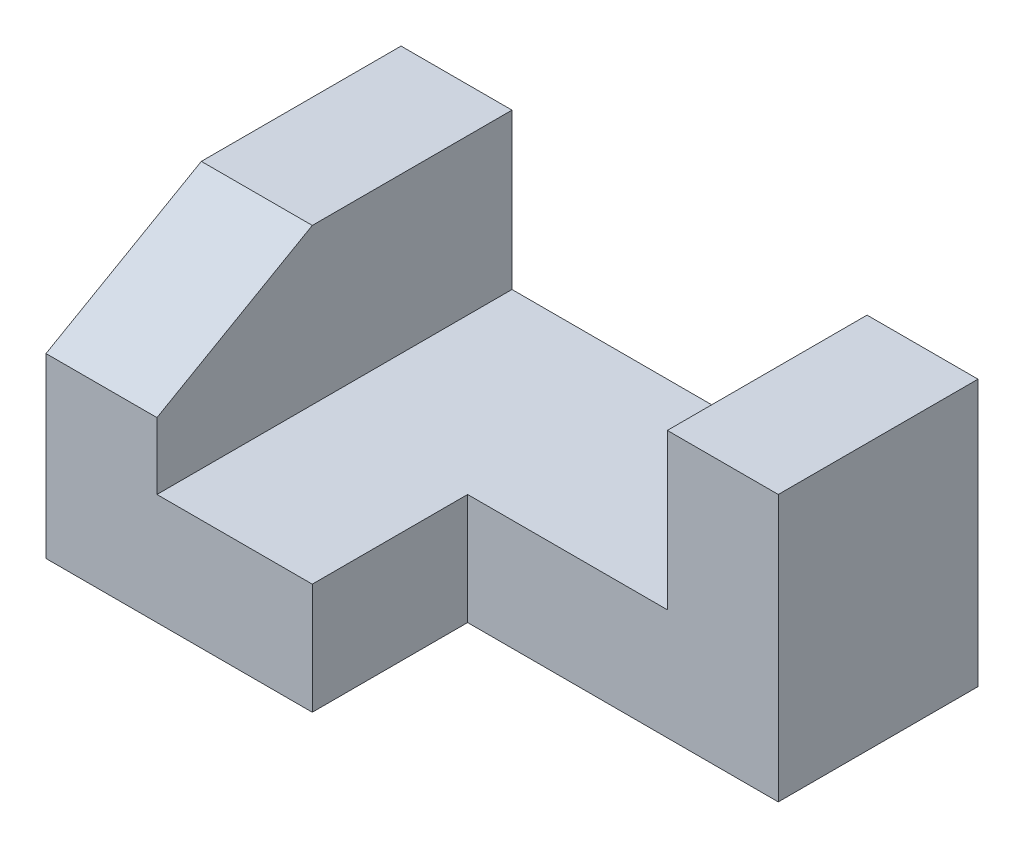
ISO-10303-21;
HEADER;
FILE_DESCRIPTION(('STEP AP214'),'2;1');
FILE_NAME('part.step','',(''),(''),'','','');
FILE_SCHEMA(('AUTOMOTIVE_DESIGN { 1 0 10303 214 1 1 1 1 }'));
ENDSEC;
DATA;
#1=APPLICATION_CONTEXT('core data for automotive mechanical design processes');
#2=APPLICATION_PROTOCOL_DEFINITION('international standard','automotive_design',2000,#1);
#3=PRODUCT_CONTEXT('',#1,'mechanical');
#4=PRODUCT('Part','Part','',(#3));
#5=PRODUCT_RELATED_PRODUCT_CATEGORY('part','',(#4));
#6=PRODUCT_DEFINITION_FORMATION('','',#4);
#7=PRODUCT_DEFINITION_CONTEXT('part definition',#1,'design');
#8=PRODUCT_DEFINITION('design','',#6,#7);
#9=PRODUCT_DEFINITION_SHAPE('','',#8);
#10=(LENGTH_UNIT() NAMED_UNIT(*) SI_UNIT(.MILLI.,.METRE.));
#11=(NAMED_UNIT(*) PLANE_ANGLE_UNIT() SI_UNIT($,.RADIAN.));
#12=(NAMED_UNIT(*) SI_UNIT($,.STERADIAN.) SOLID_ANGLE_UNIT());
#13=UNCERTAINTY_MEASURE_WITH_UNIT(LENGTH_MEASURE(1.E-05),#10,'distance_accuracy_value','');
#14=(GEOMETRIC_REPRESENTATION_CONTEXT(3) GLOBAL_UNCERTAINTY_ASSIGNED_CONTEXT((#13)) GLOBAL_UNIT_ASSIGNED_CONTEXT((#10,
#11,#12)) REPRESENTATION_CONTEXT('',''));
#15=CARTESIAN_POINT('',(0.,0.,0.));
#16=DIRECTION('',(0.,0.,1.));
#17=DIRECTION('',(1.,0.,0.));
#18=AXIS2_PLACEMENT_3D('',#15,#16,#17);
#19=CARTESIAN_POINT('',(0.,25.,0.));
#20=DIRECTION('',(0.,-1.,0.));
#21=DIRECTION('',(0.,0.,-1.));
#22=AXIS2_PLACEMENT_3D('',#19,#20,#21);
#23=PLANE('',#22);
#24=DIRECTION('',(-1.,0.,0.));
#25=VECTOR('',#24,1.);
#26=CARTESIAN_POINT('',(130.,25.,-35.));
#27=LINE('',#26,#25);
#28=CARTESIAN_POINT('',(105.,25.,-35.));
#29=VERTEX_POINT('',#28);
#30=CARTESIAN_POINT('',(60.,25.,-35.));
#31=VERTEX_POINT('',#30);
#32=EDGE_CURVE('E152',#29,#31,#27,.T.);
#33=ORIENTED_EDGE('',*,*,#32,.F.);
#34=DIRECTION('',(0.,0.,-1.));
#35=VECTOR('',#34,1.);
#36=CARTESIAN_POINT('',(105.,25.,-35.));
#37=LINE('',#36,#35);
#38=CARTESIAN_POINT('',(105.,25.,-80.));
#39=VERTEX_POINT('',#38);
#40=EDGE_CURVE('E211',#29,#39,#37,.T.);
#41=ORIENTED_EDGE('',*,*,#40,.T.);
#42=DIRECTION('',(1.,0.,0.));
#43=VECTOR('',#42,1.);
#44=CARTESIAN_POINT('',(0.,25.,-80.));
#45=LINE('',#44,#43);
#46=CARTESIAN_POINT('',(25.,25.,-80.));
#47=VERTEX_POINT('',#46);
#48=EDGE_CURVE('E109',#47,#39,#45,.T.);
#49=ORIENTED_EDGE('',*,*,#48,.F.);
#50=DIRECTION('',(0.,0.,-1.));
#51=VECTOR('',#50,1.);
#52=CARTESIAN_POINT('',(25.,25.,0.));
#53=LINE('',#52,#51);
#54=CARTESIAN_POINT('',(25.,25.,0.));
#55=VERTEX_POINT('',#54);
#56=EDGE_CURVE('E57',#55,#47,#53,.T.);
#57=ORIENTED_EDGE('',*,*,#56,.F.);
#58=DIRECTION('',(1.,0.,0.));
#59=VECTOR('',#58,1.);
#60=CARTESIAN_POINT('',(0.,25.,0.));
#61=LINE('',#60,#59);
#62=CARTESIAN_POINT('',(60.,25.,0.));
#63=VERTEX_POINT('',#62);
#64=EDGE_CURVE('E62',#55,#63,#61,.T.);
#65=ORIENTED_EDGE('',*,*,#64,.T.);
#66=DIRECTION('',(0.,0.,-1.));
#67=VECTOR('',#66,1.);
#68=CARTESIAN_POINT('',(60.,25.,0.));
#69=LINE('',#68,#67);
#70=EDGE_CURVE('E150',#63,#31,#69,.T.);
#71=ORIENTED_EDGE('',*,*,#70,.T.);
#72=EDGE_LOOP('',(#33,#41,#49,#57,#65,#71));
#73=FACE_BOUND('',#72,.T.);
#74=ADVANCED_FACE('F39',(#73),#23,.F.);
#75=CARTESIAN_POINT('',(0.,25.,0.));
#76=DIRECTION('',(-1.,0.,0.));
#77=DIRECTION('',(0.,0.,1.));
#78=AXIS2_PLACEMENT_3D('',#75,#76,#77);
#79=PLANE('',#78);
#80=DIRECTION('',(0.,0.,-1.));
#81=VECTOR('',#80,1.);
#82=CARTESIAN_POINT('',(0.,0.,0.));
#83=LINE('',#82,#81);
#84=CARTESIAN_POINT('',(0.,0.,0.));
#85=VERTEX_POINT('',#84);
#86=CARTESIAN_POINT('',(0.,0.,-80.));
#87=VERTEX_POINT('',#86);
#88=EDGE_CURVE('E104',#85,#87,#83,.T.);
#89=ORIENTED_EDGE('',*,*,#88,.F.);
#90=DIRECTION('',(0.,-1.,0.));
#91=VECTOR('',#90,1.);
#92=CARTESIAN_POINT('',(0.,25.,0.));
#93=LINE('',#92,#91);
#94=CARTESIAN_POINT('',(0.,40.,0.));
#95=VERTEX_POINT('',#94);
#96=EDGE_CURVE('E11',#95,#85,#93,.T.);
#97=ORIENTED_EDGE('',*,*,#96,.F.);
#98=DIRECTION('',(0.,0.496138938356834,-0.868243142124459));
#99=VECTOR('',#98,1.);
#100=CARTESIAN_POINT('',(0.,30.1538461538462,17.2307692307692));
#101=LINE('',#100,#99);
#102=CARTESIAN_POINT('',(0.,60.,-35.));
#103=VERTEX_POINT('',#102);
#104=EDGE_CURVE('E172',#95,#103,#101,.T.);
#105=ORIENTED_EDGE('',*,*,#104,.T.);
#106=DIRECTION('',(0.,0.,1.));
#107=VECTOR('',#106,1.);
#108=CARTESIAN_POINT('',(0.,60.,0.));
#109=LINE('',#108,#107);
#110=CARTESIAN_POINT('',(0.,60.,-80.));
#111=VERTEX_POINT('',#110);
#112=EDGE_CURVE('E167',#111,#103,#109,.T.);
#113=ORIENTED_EDGE('',*,*,#112,.F.);
#114=DIRECTION('',(0.,-1.,0.));
#115=VECTOR('',#114,1.);
#116=CARTESIAN_POINT('',(0.,25.,-80.));
#117=LINE('',#116,#115);
#118=EDGE_CURVE('E43',#111,#87,#117,.T.);
#119=ORIENTED_EDGE('',*,*,#118,.T.);
#120=EDGE_LOOP('',(#89,#97,#105,#113,#119));
#121=FACE_BOUND('',#120,.T.);
#122=ADVANCED_FACE('F41',(#121),#79,.T.);
#123=CARTESIAN_POINT('',(0.,25.,0.));
#124=DIRECTION('',(0.,0.,-1.));
#125=DIRECTION('',(-1.,0.,0.));
#126=AXIS2_PLACEMENT_3D('',#123,#124,#125);
#127=PLANE('',#126);
#128=DIRECTION('',(1.,0.,0.));
#129=VECTOR('',#128,1.);
#130=CARTESIAN_POINT('',(0.,0.,0.));
#131=LINE('',#130,#129);
#132=CARTESIAN_POINT('',(60.,0.,0.));
#133=VERTEX_POINT('',#132);
#134=EDGE_CURVE('E89',#85,#133,#131,.T.);
#135=ORIENTED_EDGE('',*,*,#134,.T.);
#136=DIRECTION('',(0.,-1.,0.));
#137=VECTOR('',#136,1.);
#138=CARTESIAN_POINT('',(60.,25.,0.));
#139=LINE('',#138,#137);
#140=EDGE_CURVE('E49',#63,#133,#139,.T.);
#141=ORIENTED_EDGE('',*,*,#140,.F.);
#142=ORIENTED_EDGE('',*,*,#64,.F.);
#143=DIRECTION('',(0.,1.,0.));
#144=VECTOR('',#143,1.);
#145=CARTESIAN_POINT('',(25.,0.,0.));
#146=LINE('',#145,#144);
#147=CARTESIAN_POINT('',(25.,40.,0.));
#148=VERTEX_POINT('',#147);
#149=EDGE_CURVE('E171',#55,#148,#146,.T.);
#150=ORIENTED_EDGE('',*,*,#149,.T.);
#151=DIRECTION('',(-1.,0.,0.));
#152=VECTOR('',#151,1.);
#153=CARTESIAN_POINT('',(25.,40.,0.));
#154=LINE('',#153,#152);
#155=EDGE_CURVE('E94',#148,#95,#154,.T.);
#156=ORIENTED_EDGE('',*,*,#155,.T.);
#157=ORIENTED_EDGE('',*,*,#96,.T.);
#158=EDGE_LOOP('',(#135,#141,#142,#150,#156,#157));
#159=FACE_BOUND('',#158,.T.);
#160=ADVANCED_FACE('F88',(#159),#127,.F.);
#161=CARTESIAN_POINT('',(60.,25.,0.));
#162=DIRECTION('',(-1.,0.,0.));
#163=DIRECTION('',(0.,0.,1.));
#164=AXIS2_PLACEMENT_3D('',#161,#162,#163);
#165=PLANE('',#164);
#166=DIRECTION('',(0.,0.,-1.));
#167=VECTOR('',#166,1.);
#168=CARTESIAN_POINT('',(60.,0.,0.));
#169=LINE('',#168,#167);
#170=CARTESIAN_POINT('',(60.,0.,-35.));
#171=VERTEX_POINT('',#170);
#172=EDGE_CURVE('E107',#133,#171,#169,.T.);
#173=ORIENTED_EDGE('',*,*,#172,.T.);
#174=DIRECTION('',(0.,-1.,0.));
#175=VECTOR('',#174,1.);
#176=CARTESIAN_POINT('',(60.,25.,-35.));
#177=LINE('',#176,#175);
#178=EDGE_CURVE('E138',#31,#171,#177,.T.);
#179=ORIENTED_EDGE('',*,*,#178,.F.);
#180=ORIENTED_EDGE('',*,*,#70,.F.);
#181=ORIENTED_EDGE('',*,*,#140,.T.);
#182=EDGE_LOOP('',(#173,#179,#180,#181));
#183=FACE_BOUND('',#182,.T.);
#184=ADVANCED_FACE('F268',(#183),#165,.F.);
#185=CARTESIAN_POINT('',(130.,25.,-35.));
#186=DIRECTION('',(0.,0.,1.));
#187=DIRECTION('',(1.,0.,0.));
#188=AXIS2_PLACEMENT_3D('',#185,#186,#187);
#189=PLANE('',#188);
#190=DIRECTION('',(-1.,0.,0.));
#191=VECTOR('',#190,1.);
#192=CARTESIAN_POINT('',(130.,0.,-35.));
#193=LINE('',#192,#191);
#194=CARTESIAN_POINT('',(130.,0.,-35.));
#195=VERTEX_POINT('',#194);
#196=EDGE_CURVE('E131',#195,#171,#193,.T.);
#197=ORIENTED_EDGE('',*,*,#196,.F.);
#198=DIRECTION('',(0.,-1.,0.));
#199=VECTOR('',#198,1.);
#200=CARTESIAN_POINT('',(130.,25.,-35.));
#201=LINE('',#200,#199);
#202=CARTESIAN_POINT('',(130.,60.,-35.));
#203=VERTEX_POINT('',#202);
#204=EDGE_CURVE('E141',#203,#195,#201,.T.);
#205=ORIENTED_EDGE('',*,*,#204,.F.);
#206=DIRECTION('',(1.,0.,0.));
#207=VECTOR('',#206,1.);
#208=CARTESIAN_POINT('',(105.,60.,-35.));
#209=LINE('',#208,#207);
#210=CARTESIAN_POINT('',(105.,60.,-35.));
#211=VERTEX_POINT('',#210);
#212=EDGE_CURVE('E175',#211,#203,#209,.T.);
#213=ORIENTED_EDGE('',*,*,#212,.F.);
#214=DIRECTION('',(0.,-1.,0.));
#215=VECTOR('',#214,1.);
#216=CARTESIAN_POINT('',(105.,25.,-35.));
#217=LINE('',#216,#215);
#218=EDGE_CURVE('E203',#211,#29,#217,.T.);
#219=ORIENTED_EDGE('',*,*,#218,.T.);
#220=ORIENTED_EDGE('',*,*,#32,.T.);
#221=ORIENTED_EDGE('',*,*,#178,.T.);
#222=EDGE_LOOP('',(#197,#205,#213,#219,#220,#221));
#223=FACE_BOUND('',#222,.T.);
#224=ADVANCED_FACE('F222',(#223),#189,.T.);
#225=CARTESIAN_POINT('',(130.,25.,-35.));
#226=DIRECTION('',(-1.,0.,0.));
#227=DIRECTION('',(0.,0.,1.));
#228=AXIS2_PLACEMENT_3D('',#225,#226,#227);
#229=PLANE('',#228);
#230=DIRECTION('',(0.,0.,-1.));
#231=VECTOR('',#230,1.);
#232=CARTESIAN_POINT('',(130.,0.,-35.));
#233=LINE('',#232,#231);
#234=CARTESIAN_POINT('',(130.,0.,-80.));
#235=VERTEX_POINT('',#234);
#236=EDGE_CURVE('E120',#195,#235,#233,.T.);
#237=ORIENTED_EDGE('',*,*,#236,.T.);
#238=DIRECTION('',(0.,-1.,0.));
#239=VECTOR('',#238,1.);
#240=CARTESIAN_POINT('',(130.,25.,-80.));
#241=LINE('',#240,#239);
#242=CARTESIAN_POINT('',(130.,60.,-80.));
#243=VERTEX_POINT('',#242);
#244=EDGE_CURVE('E143',#243,#235,#241,.T.);
#245=ORIENTED_EDGE('',*,*,#244,.F.);
#246=DIRECTION('',(0.,0.,1.));
#247=VECTOR('',#246,1.);
#248=CARTESIAN_POINT('',(130.,60.,-35.));
#249=LINE('',#248,#247);
#250=EDGE_CURVE('E199',#243,#203,#249,.T.);
#251=ORIENTED_EDGE('',*,*,#250,.T.);
#252=ORIENTED_EDGE('',*,*,#204,.T.);
#253=EDGE_LOOP('',(#237,#245,#251,#252));
#254=FACE_BOUND('',#253,.T.);
#255=ADVANCED_FACE('F265',(#254),#229,.F.);
#256=CARTESIAN_POINT('',(0.,25.,-80.));
#257=DIRECTION('',(0.,0.,-1.));
#258=DIRECTION('',(-1.,0.,0.));
#259=AXIS2_PLACEMENT_3D('',#256,#257,#258);
#260=PLANE('',#259);
#261=DIRECTION('',(1.,0.,0.));
#262=VECTOR('',#261,1.);
#263=CARTESIAN_POINT('',(0.,0.,-80.));
#264=LINE('',#263,#262);
#265=EDGE_CURVE('E115',#87,#235,#264,.T.);
#266=ORIENTED_EDGE('',*,*,#265,.F.);
#267=ORIENTED_EDGE('',*,*,#118,.F.);
#268=DIRECTION('',(-1.,0.,0.));
#269=VECTOR('',#268,1.);
#270=CARTESIAN_POINT('',(25.,60.,-80.));
#271=LINE('',#270,#269);
#272=CARTESIAN_POINT('',(25.,60.,-80.));
#273=VERTEX_POINT('',#272);
#274=EDGE_CURVE('E116',#273,#111,#271,.T.);
#275=ORIENTED_EDGE('',*,*,#274,.F.);
#276=DIRECTION('',(0.,1.,0.));
#277=VECTOR('',#276,1.);
#278=CARTESIAN_POINT('',(25.,0.,-80.));
#279=LINE('',#278,#277);
#280=EDGE_CURVE('E178',#47,#273,#279,.T.);
#281=ORIENTED_EDGE('',*,*,#280,.F.);
#282=ORIENTED_EDGE('',*,*,#48,.T.);
#283=DIRECTION('',(0.,1.,0.));
#284=VECTOR('',#283,1.);
#285=CARTESIAN_POINT('',(105.,25.,-80.));
#286=LINE('',#285,#284);
#287=CARTESIAN_POINT('',(105.,60.,-80.));
#288=VERTEX_POINT('',#287);
#289=EDGE_CURVE('E207',#39,#288,#286,.T.);
#290=ORIENTED_EDGE('',*,*,#289,.T.);
#291=DIRECTION('',(1.,0.,0.));
#292=VECTOR('',#291,1.);
#293=CARTESIAN_POINT('',(105.,60.,-80.));
#294=LINE('',#293,#292);
#295=EDGE_CURVE('E192',#288,#243,#294,.T.);
#296=ORIENTED_EDGE('',*,*,#295,.T.);
#297=ORIENTED_EDGE('',*,*,#244,.T.);
#298=EDGE_LOOP('',(#266,#267,#275,#281,#282,#290,#296,#297));
#299=FACE_BOUND('',#298,.T.);
#300=ADVANCED_FACE('F235',(#299),#260,.T.);
#301=CARTESIAN_POINT('',(0.,0.,0.));
#302=DIRECTION('',(0.,-1.,0.));
#303=DIRECTION('',(0.,0.,-1.));
#304=AXIS2_PLACEMENT_3D('',#301,#302,#303);
#305=PLANE('',#304);
#306=ORIENTED_EDGE('',*,*,#88,.T.);
#307=ORIENTED_EDGE('',*,*,#265,.T.);
#308=ORIENTED_EDGE('',*,*,#236,.F.);
#309=ORIENTED_EDGE('',*,*,#196,.T.);
#310=ORIENTED_EDGE('',*,*,#172,.F.);
#311=ORIENTED_EDGE('',*,*,#134,.F.);
#312=EDGE_LOOP('',(#306,#307,#308,#309,#310,#311));
#313=FACE_BOUND('',#312,.T.);
#314=ADVANCED_FACE('F102',(#313),#305,.T.);
#315=CARTESIAN_POINT('',(25.,60.,0.));
#316=DIRECTION('',(0.,-1.,0.));
#317=DIRECTION('',(0.,0.,-1.));
#318=AXIS2_PLACEMENT_3D('',#315,#316,#317);
#319=PLANE('',#318);
#320=ORIENTED_EDGE('',*,*,#112,.T.);
#321=DIRECTION('',(-1.,0.,0.));
#322=VECTOR('',#321,1.);
#323=CARTESIAN_POINT('',(25.,60.,-35.));
#324=LINE('',#323,#322);
#325=CARTESIAN_POINT('',(25.,60.,-35.));
#326=VERTEX_POINT('',#325);
#327=EDGE_CURVE('E123',#326,#103,#324,.T.);
#328=ORIENTED_EDGE('',*,*,#327,.F.);
#329=DIRECTION('',(0.,0.,1.));
#330=VECTOR('',#329,1.);
#331=CARTESIAN_POINT('',(25.,60.,0.));
#332=LINE('',#331,#330);
#333=EDGE_CURVE('E182',#273,#326,#332,.T.);
#334=ORIENTED_EDGE('',*,*,#333,.F.);
#335=ORIENTED_EDGE('',*,*,#274,.T.);
#336=EDGE_LOOP('',(#320,#328,#334,#335));
#337=FACE_BOUND('',#336,.T.);
#338=ADVANCED_FACE('F271',(#337),#319,.F.);
#339=CARTESIAN_POINT('',(25.,30.1538461538462,17.2307692307692));
#340=DIRECTION('',(0.,0.868243142124459,0.496138938356834));
#341=DIRECTION('',(0.,-0.496138938356834,0.868243142124459));
#342=AXIS2_PLACEMENT_3D('',#339,#340,#341);
#343=PLANE('',#342);
#344=ORIENTED_EDGE('',*,*,#104,.F.);
#345=ORIENTED_EDGE('',*,*,#155,.F.);
#346=DIRECTION('',(0.,0.496138938356834,-0.868243142124459));
#347=VECTOR('',#346,1.);
#348=CARTESIAN_POINT('',(25.,30.1538461538462,17.2307692307692));
#349=LINE('',#348,#347);
#350=EDGE_CURVE('E186',#148,#326,#349,.T.);
#351=ORIENTED_EDGE('',*,*,#350,.T.);
#352=ORIENTED_EDGE('',*,*,#327,.T.);
#353=EDGE_LOOP('',(#344,#345,#351,#352));
#354=FACE_BOUND('',#353,.T.);
#355=ADVANCED_FACE('F269',(#354),#343,.T.);
#356=CARTESIAN_POINT('',(25.,0.,0.));
#357=DIRECTION('',(-1.,0.,0.));
#358=DIRECTION('',(0.,0.,1.));
#359=AXIS2_PLACEMENT_3D('',#356,#357,#358);
#360=PLANE('',#359);
#361=ORIENTED_EDGE('',*,*,#149,.F.);
#362=ORIENTED_EDGE('',*,*,#56,.T.);
#363=ORIENTED_EDGE('',*,*,#280,.T.);
#364=ORIENTED_EDGE('',*,*,#333,.T.);
#365=ORIENTED_EDGE('',*,*,#350,.F.);
#366=EDGE_LOOP('',(#361,#362,#363,#364,#365));
#367=FACE_BOUND('',#366,.T.);
#368=ADVANCED_FACE('F242',(#367),#360,.F.);
#369=CARTESIAN_POINT('',(105.,60.,-35.));
#370=DIRECTION('',(0.,1.,0.));
#371=DIRECTION('',(0.,0.,1.));
#372=AXIS2_PLACEMENT_3D('',#369,#370,#371);
#373=PLANE('',#372);
#374=ORIENTED_EDGE('',*,*,#250,.F.);
#375=ORIENTED_EDGE('',*,*,#295,.F.);
#376=DIRECTION('',(0.,0.,1.));
#377=VECTOR('',#376,1.);
#378=CARTESIAN_POINT('',(105.,60.,-35.));
#379=LINE('',#378,#377);
#380=EDGE_CURVE('E195',#288,#211,#379,.T.);
#381=ORIENTED_EDGE('',*,*,#380,.T.);
#382=ORIENTED_EDGE('',*,*,#212,.T.);
#383=EDGE_LOOP('',(#374,#375,#381,#382));
#384=FACE_BOUND('',#383,.T.);
#385=ADVANCED_FACE('F263',(#384),#373,.T.);
#386=CARTESIAN_POINT('',(105.,0.,0.));
#387=DIRECTION('',(-1.,0.,0.));
#388=DIRECTION('',(0.,0.,1.));
#389=AXIS2_PLACEMENT_3D('',#386,#387,#388);
#390=PLANE('',#389);
#391=ORIENTED_EDGE('',*,*,#218,.F.);
#392=ORIENTED_EDGE('',*,*,#380,.F.);
#393=ORIENTED_EDGE('',*,*,#289,.F.);
#394=ORIENTED_EDGE('',*,*,#40,.F.);
#395=EDGE_LOOP('',(#391,#392,#393,#394));
#396=FACE_BOUND('',#395,.T.);
#397=ADVANCED_FACE('F371',(#396),#390,.T.);
#398=CLOSED_SHELL('',(#74,#122,#160,#184,#224,#255,#300,#314,#338,#355,#368,#385,#397));
#399=MANIFOLD_SOLID_BREP('B2',#398);
#400=ADVANCED_BREP_SHAPE_REPRESENTATION('',(#18,#399),#14);
#401=SHAPE_DEFINITION_REPRESENTATION(#9,#400);
ENDSEC;
END-ISO-10303-21;
